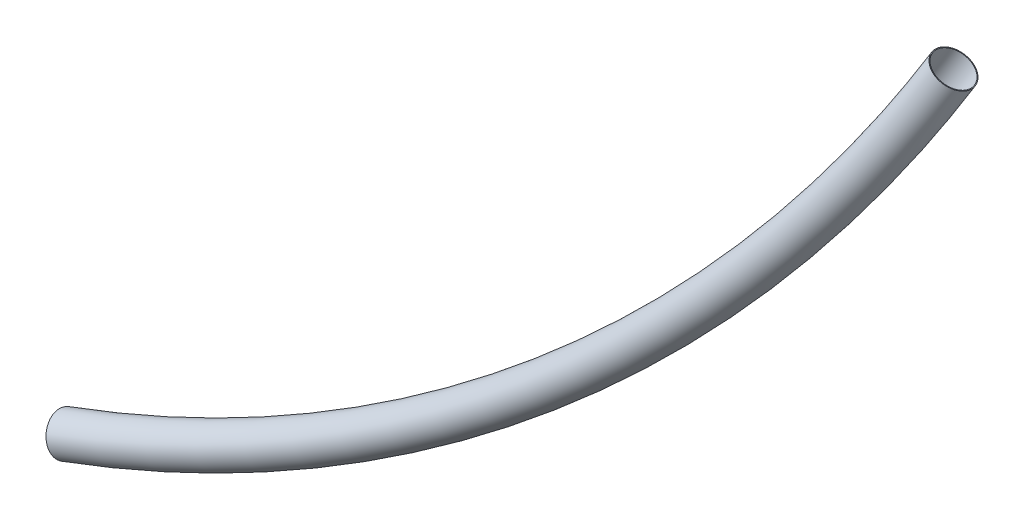
ISO-10303-21;
HEADER;
FILE_DESCRIPTION(('STEP AP214'),'2;1');
FILE_NAME('part.step','',(''),(''),'','','');
FILE_SCHEMA(('AUTOMOTIVE_DESIGN { 1 0 10303 214 1 1 1 1 }'));
ENDSEC;
DATA;
#1=APPLICATION_CONTEXT('core data for automotive mechanical design processes');
#2=APPLICATION_PROTOCOL_DEFINITION('international standard','automotive_design',2000,#1);
#3=PRODUCT_CONTEXT('',#1,'mechanical');
#4=PRODUCT('Part','Part','',(#3));
#5=PRODUCT_RELATED_PRODUCT_CATEGORY('part','',(#4));
#6=PRODUCT_DEFINITION_FORMATION('','',#4);
#7=PRODUCT_DEFINITION_CONTEXT('part definition',#1,'design');
#8=PRODUCT_DEFINITION('design','',#6,#7);
#9=PRODUCT_DEFINITION_SHAPE('','',#8);
#10=(LENGTH_UNIT() NAMED_UNIT(*) SI_UNIT(.MILLI.,.METRE.));
#11=(NAMED_UNIT(*) PLANE_ANGLE_UNIT() SI_UNIT($,.RADIAN.));
#12=(NAMED_UNIT(*) SI_UNIT($,.STERADIAN.) SOLID_ANGLE_UNIT());
#13=UNCERTAINTY_MEASURE_WITH_UNIT(LENGTH_MEASURE(1.E-05),#10,'distance_accuracy_value','');
#14=(GEOMETRIC_REPRESENTATION_CONTEXT(3) GLOBAL_UNCERTAINTY_ASSIGNED_CONTEXT((#13)) GLOBAL_UNIT_ASSIGNED_CONTEXT((#10,
#11,#12)) REPRESENTATION_CONTEXT('',''));
#15=CARTESIAN_POINT('',(0.,0.,0.));
#16=DIRECTION('',(0.,0.,1.));
#17=DIRECTION('',(1.,0.,0.));
#18=AXIS2_PLACEMENT_3D('',#15,#16,#17);
#19=CARTESIAN_POINT('',(8516.99642217387,-1259.02168144513,3224.99147900885));
#20=DIRECTION('',(-0.46359197170207,-0.867083552561219,0.182341977205477));
#21=DIRECTION('',(0.881867916549809,-0.471496529955523,0.));
#22=AXIS2_PLACEMENT_3D('',#19,#20,#21);
#23=PLANE('',#22);
#24=CARTESIAN_POINT('',(8516.99642217388,-1259.02168144513,3224.99147900885));
#25=DIRECTION('',(-0.46359197170207,-0.867083552561219,0.182341977205477));
#26=DIRECTION('',(0.881867916549809,-0.471496529955523,0.));
#27=AXIS2_PLACEMENT_3D('',#24,#25,#26);
#28=CIRCLE('',#27,80.7339);
#29=CARTESIAN_POINT('',(8588.19305836182,-1297.0874351449,3224.99147900885));
#30=VERTEX_POINT('',#29);
#31=EDGE_CURVE('E53',#30,#30,#28,.T.);
#32=ORIENTED_EDGE('',*,*,#31,.T.);
#33=EDGE_LOOP('',(#32));
#34=FACE_BOUND('',#33,.T.);
#35=CARTESIAN_POINT('',(8516.99642217387,-1259.02168144513,3224.99147900885));
#36=DIRECTION('',(-0.46359197170207,-0.867083552561219,0.182341977205477));
#37=DIRECTION('',(0.881867916549809,-0.471496529955523,0.));
#38=AXIS2_PLACEMENT_3D('',#35,#36,#37);
#39=CIRCLE('',#38,84.1375000000002);
#40=CARTESIAN_POINT('',(8591.19458400258,-1298.69222073426,3224.99147900885));
#41=VERTEX_POINT('',#40);
#42=EDGE_CURVE('E40',#41,#41,#39,.T.);
#43=ORIENTED_EDGE('',*,*,#42,.F.);
#44=EDGE_LOOP('',(#43));
#45=FACE_BOUND('',#44,.T.);
#46=ADVANCED_FACE('F37',(#34,#45),#23,.F.);
#47=CARTESIAN_POINT('',(3473.83184735843,1326.5913653168,2698.35430969954));
#48=DIRECTION('',(0.00260505369622823,0.204457537577132,0.978871967635776));
#49=DIRECTION('',(0.,-0.978875289114428,0.204458231336244));
#50=AXIS2_PLACEMENT_3D('',#47,#48,#49);
#51=TOROIDAL_SURFACE('',#50,5691.77041564021,80.7339);
#52=ORIENTED_EDGE('',*,*,#31,.F.);
#53=EDGE_LOOP('',(#52));
#54=FACE_BOUND('',#53,.T.);
#55=CARTESIAN_POINT('',(5271.00743587228,-4012.66439385455,3734.93598349893));
#56=CARTESIAN_POINT('',(5270.66498495116,-4011.83070399339,3734.24675022501));
#57=CARTESIAN_POINT('',(5270.31890145055,-4010.98288660137,3733.57646934526));
#58=CARTESIAN_POINT('',(5269.62003322443,-4009.26037992345,3732.27489627241));
#59=CARTESIAN_POINT('',(5269.26724803139,-4008.38568876008,3731.64360681268));
#60=CARTESIAN_POINT('',(5268.55556891435,-4006.61090060294,3730.42109151935));
#61=CARTESIAN_POINT('',(5268.19667388596,-4005.71079899629,3729.82987302714));
#62=CARTESIAN_POINT('',(5267.47344042779,-4003.88685413334,3728.68861781693));
#63=CARTESIAN_POINT('',(5267.10910149709,-4002.96300868658,3728.13858491693));
#64=CARTESIAN_POINT('',(5266.37528710098,-4001.09234718595,3727.08019930887));
#65=CARTESIAN_POINT('',(5266.00580678088,-4000.14550868977,3726.57188963299));
#66=CARTESIAN_POINT('',(5265.26269660957,-3998.23136530748,3725.59843309159));
#67=CARTESIAN_POINT('',(5264.88906637272,-3997.26405851162,3725.13329027568));
#68=CARTESIAN_POINT('',(5264.13841603661,-3995.3109440878,3724.2471190517));
#69=CARTESIAN_POINT('',(5263.76139649031,-3994.32513945025,3723.82608358435));
#70=CARTESIAN_POINT('',(5263.00454418637,-3992.33654084153,3723.02875258526));
#71=CARTESIAN_POINT('',(5262.62471116882,-3991.33374528948,3722.65246124307));
#72=CARTESIAN_POINT('',(5261.86315525298,-3989.31360322114,3721.94552979558));
#73=CARTESIAN_POINT('',(5261.48143352534,-3988.29626512175,3721.61486437667));
#74=CARTESIAN_POINT('',(5260.71653343945,-3986.24820569901,3720.99949510434));
#75=CARTESIAN_POINT('',(5260.3333549483,-3985.21748313289,3720.71479555235));
#76=CARTESIAN_POINT('',(5259.56628749241,-3983.14466014143,3720.19192107201));
#77=CARTESIAN_POINT('',(5259.18239858517,-3982.10256060643,3719.95374253021));
#78=CARTESIAN_POINT('',(5258.41452956978,-3980.00866665879,3719.52428478383));
#79=CARTESIAN_POINT('',(5258.03054945646,-3978.95687134874,3719.33300996664));
#80=CARTESIAN_POINT('',(5257.26334187437,-3976.8458958375,3718.99778731906));
#81=CARTESIAN_POINT('',(5256.88011418974,-3975.78671834115,3718.85382299828));
#82=CARTESIAN_POINT('',(5256.11495506441,-3973.66249193245,3718.61337059656));
#83=CARTESIAN_POINT('',(5255.7330237482,-3972.59744248062,3718.51688695383));
#84=CARTESIAN_POINT('',(5254.59027075199,-3969.39653132042,3718.29899505069));
#85=CARTESIAN_POINT('',(5253.83228018418,-3967.25432941673,3718.24905419793));
#86=CARTESIAN_POINT('',(5252.32954081469,-3962.96906689418,3718.34031815006));
#87=CARTESIAN_POINT('',(5251.5847954419,-3960.82600619569,3718.48157174172));
#88=CARTESIAN_POINT('',(5250.11390543987,-3956.55443569039,3718.95426409172));
#89=CARTESIAN_POINT('',(5249.38776083156,-3954.42592589995,3719.2857030641));
#90=CARTESIAN_POINT('',(5247.95924321266,-3950.19860672172,3720.13644350404));
#91=CARTESIAN_POINT('',(5247.25687114232,-3948.09979851061,3720.65575239283));
#92=CARTESIAN_POINT('',(5245.88091413572,-3943.9468661602,3721.8785423178));
#93=CARTESIAN_POINT('',(5245.20732919257,-3941.89274201022,3722.58202330991));
#94=CARTESIAN_POINT('',(5243.89375173318,-3937.84382918859,3724.16815142649));
#95=CARTESIAN_POINT('',(5243.25375861596,-3935.84903945568,3725.05079534423));
#96=CARTESIAN_POINT('',(5242.01190443666,-3931.93294438367,3726.98899157151));
#97=CARTESIAN_POINT('',(5241.41004337681,-3930.01163904889,3728.04454389119));
#98=CARTESIAN_POINT('',(5240.24873848175,-3926.25618864204,3730.32105925529));
#99=CARTESIAN_POINT('',(5239.68929453721,-3924.4220433453,3731.54202187329));
#100=CARTESIAN_POINT('',(5238.61680518653,-3920.85396193948,3734.14068802849));
#101=CARTESIAN_POINT('',(5238.10375977165,-3919.12002581149,3735.51839153611));
#102=CARTESIAN_POINT('',(5237.12782587628,-3915.76506613521,3738.42044108615));
#103=CARTESIAN_POINT('',(5236.66492670843,-3914.14401855408,3739.94475575095));
#104=CARTESIAN_POINT('',(5235.79245665129,-3911.02596971855,3743.12944592523));
#105=CARTESIAN_POINT('',(5235.38288575634,-3909.52896845101,3744.78982142028));
#106=CARTESIAN_POINT('',(5234.61999199201,-3906.66967777335,3748.23482801504));
#107=CARTESIAN_POINT('',(5234.2666689481,-3905.30738794526,3750.01945872918));
#108=CARTESIAN_POINT('',(5233.61878838017,-3902.72722010602,3753.70029281165));
#109=CARTESIAN_POINT('',(5233.3242308422,-3901.50934206059,3755.59649615348));
#110=CARTESIAN_POINT('',(5232.79607182494,-3899.22706339081,3759.48633123813));
#111=CARTESIAN_POINT('',(5232.56244974355,-3898.16261094829,3761.47992978053));
#112=CARTESIAN_POINT('',(5232.15769726214,-3896.194276029,3765.55097504697));
#113=CARTESIAN_POINT('',(5231.98656684905,-3895.29039351865,3767.62842175347));
#114=CARTESIAN_POINT('',(5231.70801927978,-3893.64963944021,3771.85238955101));
#115=CARTESIAN_POINT('',(5231.60060209832,-3892.91276780588,3773.99891061466));
#116=CARTESIAN_POINT('',(5231.45024863702,-3891.61128684538,3778.34575984177));
#117=CARTESIAN_POINT('',(5231.40731234577,-3891.04667748876,3780.54608799571));
#118=CARTESIAN_POINT('',(5231.38623208875,-3890.09389385722,3784.98420651887));
#119=CARTESIAN_POINT('',(5231.40806796745,-3889.70566474036,3787.22198501896));
#120=CARTESIAN_POINT('',(5231.51633490982,-3889.10814910885,3791.71975891751));
#121=CARTESIAN_POINT('',(5231.60276595914,-3888.89886255442,3793.97975431104));
#122=CARTESIAN_POINT('',(5231.83960920545,-3888.66072268667,3798.50588732864));
#123=CARTESIAN_POINT('',(5231.99002131514,-3888.63186912712,3800.77202494433));
#124=CARTESIAN_POINT('',(5232.35375680773,-3888.75479920681,3805.29432981698));
#125=CARTESIAN_POINT('',(5232.56708018828,-3888.90658283928,3807.5504970743));
#126=CARTESIAN_POINT('',(5233.05508544696,-3889.38967028026,3812.03649924927));
#127=CARTESIAN_POINT('',(5233.32975863669,-3889.72094867803,3814.26633784857));
#128=CARTESIAN_POINT('',(5233.93852598823,-3890.56064793685,3818.68415685735));
#129=CARTESIAN_POINT('',(5234.27262014221,-3891.06906877456,3820.87213727236));
#130=CARTESIAN_POINT('',(5234.99785184207,-3892.25943063008,3825.19068957133));
#131=CARTESIAN_POINT('',(5235.38898939394,-3892.94137166614,3827.32126144925));
#132=CARTESIAN_POINT('',(5236.22552449942,-3894.47391672531,3831.50985711328));
#133=CARTESIAN_POINT('',(5236.67092205949,-3895.3245207685,3833.56788089076));
#134=CARTESIAN_POINT('',(5237.61285127195,-3897.18842053379,3837.59694439208));
#135=CARTESIAN_POINT('',(5238.10938759982,-3898.20173113645,3839.56797613891));
#136=CARTESIAN_POINT('',(5239.15002779161,-3900.38377430137,3843.40885437407));
#137=CARTESIAN_POINT('',(5239.69413165635,-3901.55250686629,3845.27870086066));
#138=CARTESIAN_POINT('',(5240.8260372482,-3904.03707741523,3848.90393256688));
#139=CARTESIAN_POINT('',(5241.41383901298,-3905.35291552604,3850.65931768785));
#140=CARTESIAN_POINT('',(5242.62896026645,-3908.12233534375,3854.04316451136));
#141=CARTESIAN_POINT('',(5243.25627976383,-3909.57591708095,3855.67162618597));
#142=CARTESIAN_POINT('',(5244.54615901269,-3912.61091510639,3858.79051021053));
#143=CARTESIAN_POINT('',(5245.2087286496,-3914.19236731954,3860.28089351358));
#144=CARTESIAN_POINT('',(5246.56423486567,-3917.47150143588,3863.11252463582));
#145=CARTESIAN_POINT('',(5247.25717144961,-3919.16918335739,3864.45377243153));
#146=CARTESIAN_POINT('',(5248.66848702073,-3922.66870837319,3866.97761793528));
#147=CARTESIAN_POINT('',(5249.38686604518,-3924.47055162002,3868.16021541099));
#148=CARTESIAN_POINT('',(5250.84396065092,-3928.16558976613,3870.35836993244));
#149=CARTESIAN_POINT('',(5251.58267623673,-3930.05878468566,3871.37392694119));
#150=CARTESIAN_POINT('',(5253.07545284821,-3933.92373892293,3873.23111866393));
#151=CARTESIAN_POINT('',(5253.82951906635,-3935.89552504828,3874.07269341609));
#152=CARTESIAN_POINT('',(5255.34739079166,-3939.9030331801,3875.57551057368));
#153=CARTESIAN_POINT('',(5256.11119630103,-3941.93875520098,3876.23675293846));
#154=CARTESIAN_POINT('',(5257.64311959117,-3946.05966910383,3877.37421567115));
#155=CARTESIAN_POINT('',(5258.41123737696,-3948.14486104339,3877.85043582362));
#156=CARTESIAN_POINT('',(5259.94632655044,-3952.34989511006,3878.61447554968));
#157=CARTESIAN_POINT('',(5260.71329793798,-3954.46973724149,3878.9022950997));
#158=CARTESIAN_POINT('',(5262.24083844085,-3958.72954901101,3879.28754089574));
#159=CARTESIAN_POINT('',(5263.00140588736,-3960.86952360556,3879.38491895497));
#160=CARTESIAN_POINT('',(5264.51053547435,-3965.15385928879,3879.38844514134));
#161=CARTESIAN_POINT('',(5265.25909761252,-3967.2982203783,3879.29459323161));
#162=CARTESIAN_POINT('',(5266.73889598508,-3971.57608789151,3878.916324382));
#163=CARTESIAN_POINT('',(5267.47013220189,-3973.70959430418,3878.63190724862));
#164=CARTESIAN_POINT('',(5268.91007924986,-3977.95058317828,3877.87452489271));
#165=CARTESIAN_POINT('',(5269.61879008153,-3980.0580656403,3877.40155967439));
#166=CARTESIAN_POINT('',(5271.00868457553,-3984.23213556753,3876.27040581107));
#167=CARTESIAN_POINT('',(5271.68986675207,-3986.29872082234,3875.61220718377));
#168=CARTESIAN_POINT('',(5273.01981838459,-3990.37618236663,3874.11526783418));
#169=CARTESIAN_POINT('',(5273.66858783812,-3992.38705865186,3873.27652709818));
#170=CARTESIAN_POINT('',(5274.92909731073,-3996.33879538687,3871.42445846307));
#171=CARTESIAN_POINT('',(5275.54083738088,-3998.27965593321,3870.41113080475));
#172=CARTESIAN_POINT('',(5276.72293531901,-4002.07755443191,3868.21708255663));
#173=CARTESIAN_POINT('',(5277.29329319361,-4003.93459239766,3867.03636199357));
#174=CARTESIAN_POINT('',(5278.38847566207,-4007.55132990721,3864.51612254281));
#175=CARTESIAN_POINT('',(5278.91330776626,-4009.3110454887,3863.17662993407));
#176=CARTESIAN_POINT('',(5279.91380769297,-4012.7209455326,3860.3482043634));
#177=CARTESIAN_POINT('',(5280.3894755189,-4014.37113000259,3858.8592714118));
#178=CARTESIAN_POINT('',(5281.2882592331,-4017.55022064364,3855.74254303681));
#179=CARTESIAN_POINT('',(5281.71137508416,-4019.07912672884,3854.1147475151));
#180=CARTESIAN_POINT('',(5282.50203944011,-4022.00477063223,3850.7318647149));
#181=CARTESIAN_POINT('',(5282.86958795741,-4023.40150847993,3848.97677746481));
#182=CARTESIAN_POINT('',(5283.5463923884,-4026.05245382609,3845.35235299907));
#183=CARTESIAN_POINT('',(5283.8556663617,-4027.30670543383,3843.48305141767));
#184=CARTESIAN_POINT('',(5284.41385854659,-4029.66424579418,3839.64299354602));
#185=CARTESIAN_POINT('',(5284.66277676922,-4030.76753457438,3837.67223727432));
#186=CARTESIAN_POINT('',(5285.09848240345,-4032.81529025582,3833.64328090579));
#187=CARTESIAN_POINT('',(5285.28526977565,-4033.75975705637,3831.58508075354));
#188=CARTESIAN_POINT('',(5285.59538055369,-4035.48313788809,3827.39587668257));
#189=CARTESIAN_POINT('',(5285.71870397292,-4036.26205195422,3825.26487277922));
#190=CARTESIAN_POINT('',(5285.9009783423,-4037.64856761913,3820.94586716058));
#191=CARTESIAN_POINT('',(5285.95994859096,-4038.25622053591,3818.75788273448));
#192=CARTESIAN_POINT('',(5286.01316137584,-4039.29619694726,3814.33986807669));
#193=CARTESIAN_POINT('',(5286.00740391347,-4039.72852044564,3812.10983784591));
#194=CARTESIAN_POINT('',(5285.93119853948,-4040.41474035987,3807.62365375999));
#195=CARTESIAN_POINT('',(5285.86075321892,-4040.66864392154,3805.36750095474));
#196=CARTESIAN_POINT('',(5285.65568821424,-4040.99625725645,3800.8451361574));
#197=CARTESIAN_POINT('',(5285.52106860039,-4041.06996722698,3798.57892417633));
#198=CARTESIAN_POINT('',(5285.18861628886,-4041.03662214038,3794.05284654625));
#199=CARTESIAN_POINT('',(5284.99080254282,-4040.92962123644,3791.79297919922));
#200=CARTESIAN_POINT('',(5284.64781582016,-4040.63431545015,3788.42025494713));
#201=CARTESIAN_POINT('',(5284.52575609813,-4040.51338710111,3787.29870791163));
#202=CARTESIAN_POINT('',(5284.26642037487,-4040.2268107591,3785.06314042762));
#203=CARTESIAN_POINT('',(5284.12914579687,-4040.06116694689,3783.94911928544));
#204=CARTESIAN_POINT('',(5283.83957172104,-4039.68538380026,3781.73019024118));
#205=CARTESIAN_POINT('',(5283.68726700645,-4039.47522898749,3780.62528564854));
#206=CARTESIAN_POINT('',(5283.36795693953,-4039.01085479903,3778.42702421568));
#207=CARTESIAN_POINT('',(5283.200952963,-4038.75663954513,3777.33366630544));
#208=CARTESIAN_POINT('',(5282.8525164216,-4038.20456249989,3775.16025988828));
#209=CARTESIAN_POINT('',(5282.67108273604,-4037.90669731696,3774.08021242265));
#210=CARTESIAN_POINT('',(5282.29413862114,-4037.26789581825,3771.93553245297));
#211=CARTESIAN_POINT('',(5282.09862950951,-4036.92696353206,3770.87089851711));
#212=CARTESIAN_POINT('',(5281.69375413559,-4036.20241033551,3768.75824348505));
#213=CARTESIAN_POINT('',(5281.48438016909,-4035.81876560936,3767.71023203309));
#214=CARTESIAN_POINT('',(5281.05226641963,-4035.0096649215,3765.63339515698));
#215=CARTESIAN_POINT('',(5280.8295278883,-4034.58421287281,3764.60456794796));
#216=CARTESIAN_POINT('',(5280.37102739459,-4033.69215455634,3762.56766598626));
#217=CARTESIAN_POINT('',(5280.13526335408,-4033.22554171447,3761.55959458047));
#218=CARTESIAN_POINT('',(5279.65118716021,-4032.25209764944,3759.56626087401));
#219=CARTESIAN_POINT('',(5279.4028761839,-4031.74527019633,3758.58099644639));
#220=CARTESIAN_POINT('',(5278.8943860408,-4030.69279603301,3756.63591819851));
#221=CARTESIAN_POINT('',(5278.63421916491,-4030.14718921067,3755.67607958201));
#222=CARTESIAN_POINT('',(5278.10227130411,-4029.01772572087,3753.78260859438));
#223=CARTESIAN_POINT('',(5277.83049139543,-4028.43387259523,3752.84897380804));
#224=CARTESIAN_POINT('',(5277.27582668175,-4027.22901493604,3751.00963730617));
#225=CARTESIAN_POINT('',(5276.99294390709,-4026.60801718422,3750.10393053713));
#226=CARTESIAN_POINT('',(5276.41655629837,-4025.32993780534,3748.32195826578));
#227=CARTESIAN_POINT('',(5276.12305220732,-4024.67285870067,3747.4456907123));
#228=CARTESIAN_POINT('',(5275.45171562372,-4023.1560797171,3745.51013654943));
#229=CARTESIAN_POINT('',(5275.07104948897,-4022.28659950819,3744.45947064349));
#230=CARTESIAN_POINT('',(5274.29507982835,-4020.4957471318,3742.40948365693));
#231=CARTESIAN_POINT('',(5273.89977956431,-4019.57438650451,3741.41015125162));
#232=CARTESIAN_POINT('',(5273.09554885902,-4017.68213330017,3739.46531586601));
#233=CARTESIAN_POINT('',(5272.68661841935,-4016.71124072882,3738.51981287952));
#234=CARTESIAN_POINT('',(5271.85615668475,-4014.72236495909,3736.685028782));
#235=CARTESIAN_POINT('',(5271.43462261581,-4013.70437136649,3735.79576018419));
#236=CARTESIAN_POINT('',(5271.00743587228,-4012.66439385455,3734.93598349893));
#237=B_SPLINE_CURVE_WITH_KNOTS('',3,(#55,#56,#57,#58,#59,#60,#61,#62,#63,#64,#65,#66,#67,#68,
#69,#70,#71,#72,#73,#74,#75,#76,#77,#78,#79,#80,#81,#82,#83,#84,#85,#86,#87,#88,#89,#90,#91,#92,
#93,#94,#95,#96,#97,#98,#99,#100,#101,#102,#103,#104,#105,#106,#107,#108,#109,#110,#111,#112,
#113,#114,#115,#116,#117,#118,#119,#120,#121,#122,#123,#124,#125,#126,#127,#128,#129,#130,#131,
#132,#133,#134,#135,#136,#137,#138,#139,#140,#141,#142,#143,#144,#145,#146,#147,#148,#149,#150,
#151,#152,#153,#154,#155,#156,#157,#158,#159,#160,#161,#162,#163,#164,#165,#166,#167,#168,#169,
#170,#171,#172,#173,#174,#175,#176,#177,#178,#179,#180,#181,#182,#183,#184,#185,#186,#187,#188,
#189,#190,#191,#192,#193,#194,#195,#196,#197,#198,#199,#200,#201,#202,#203,#204,#205,#206,#207,
#208,#209,#210,#211,#212,#213,#214,#215,#216,#217,#218,#219,#220,#221,#222,#223,#224,#225,#226,
#227,#228,#229,#230,#231,#232,#233,#234,#235,#236),.UNSPECIFIED.,.T.,.F.,(4,2,2,2,2,2,2,2,2,2,2,
2,2,2,2,2,2,2,2,2,2,2,2,2,2,2,2,2,2,2,2,2,2,2,2,2,2,2,2,2,2,2,2,2,2,2,2,2,2,2,2,2,2,2,2,2,2,2,2,
2,2,2,2,2,2,2,2,2,2,2,2,2,2,2,2,2,2,2,2,2,2,2,2,2,2,2,2,2,2,2,4),(0.,3.40353472593748,
6.80730777634821,10.2117027550735,13.6164129389595,17.0245916412981,20.4330897515771,
23.8410415029102,27.2493121012624,30.6556840954222,34.0623746696927,37.4688005299178,
40.8755449057775,44.2811005756542,47.6869745173889,54.4968649258857,61.3084933303509,
68.1201294012379,74.9320345743003,81.7439381173756,88.5557197489832,95.3675017801366,
102.179266251548,108.991029437139,115.801338004011,122.611645848808,129.421932562427,
136.232217658641,143.040197222572,149.848175362856,156.656150803053,163.464125039443,
170.26998102057,177.075835489341,183.881680670612,190.687525596853,197.492407284122,
204.297288074895,211.102169581124,217.907051897266,224.712556918643,231.51806205694,
238.323573060804,245.129085561678,251.936516742823,258.743948996504,265.551391219363,
272.358834949722,279.168620923908,285.978408433364,292.788203872065,299.598000162443,
306.409519290207,313.221039730918,320.032567087741,326.844094291806,333.655988641644,
340.467883508591,347.279768980197,354.091653363226,360.90241185534,367.713169877199,
374.523932721831,381.334694046048,388.143341193081,394.951987095497,401.760637314383,
408.56928609573,415.375892507983,422.182498772785,428.988832414004,435.79515860321,
442.599445519106,446.002517048631,449.405270511595,452.809209203537,456.212829633656,
459.616714664288,463.020281443651,466.425755594607,469.830911309258,473.23661187533,
476.641993539302,480.043921802551,483.445535472517,486.846529971483,490.247287013798,
494.492990005085,498.737752291519,502.982514088773,507.228217126552),.UNSPECIFIED.);
#238=CARTESIAN_POINT('',(5271.00743587228,-4012.66439385455,3734.93598349893));
#239=VERTEX_POINT('',#238);
#240=EDGE_CURVE('E48',#239,#239,#237,.T.);
#241=ORIENTED_EDGE('',*,*,#240,.F.);
#242=EDGE_LOOP('',(#241));
#243=FACE_BOUND('',#242,.T.);
#244=ADVANCED_FACE('F62',(#54,#243),#51,.F.);
#245=CARTESIAN_POINT('',(5226.28134061529,-3889.83136832527,3714.24503647697));
#246=DIRECTION('',(0.941114351142537,0.331446569951202,-0.0666854507455972));
#247=DIRECTION('',(-0.332186000076311,0.943213900106069,0.));
#248=AXIS2_PLACEMENT_3D('',#245,#246,#247);
#249=PLANE('',#248);
#250=ORIENTED_EDGE('',*,*,#240,.T.);
#251=EDGE_LOOP('',(#250));
#252=FACE_BOUND('',#251,.T.);
#253=CARTESIAN_POINT('',(5272.36474503003,-4016.71053148996,3733.98082292348));
#254=CARTESIAN_POINT('',(5272.01405932772,-4015.86548993203,3733.23179565016));
#255=CARTESIAN_POINT('',(5271.65933948037,-4015.005123336,3732.5020055494));
#256=CARTESIAN_POINT('',(5270.94240961926,-4013.2551440746,3731.08208026856));
#257=CARTESIAN_POINT('',(5270.58019908272,-4012.36552936544,3730.39194786896));
#258=CARTESIAN_POINT('',(5269.84889600435,-4010.55854444487,3729.05251224666));
#259=CARTESIAN_POINT('',(5269.47980221707,-4009.64116919145,3728.40321650764));
#260=CARTESIAN_POINT('',(5268.73541662867,-4007.78035853929,3727.14668077002));
#261=CARTESIAN_POINT('',(5268.36012425684,-4006.83692073553,3726.53944467088));
#262=CARTESIAN_POINT('',(5267.60365717341,-4004.92477110555,3725.36757597365));
#263=CARTESIAN_POINT('',(5267.22247685853,-4003.95603450992,3724.80298740931));
#264=CARTESIAN_POINT('',(5266.45525068169,-4001.99584497857,3723.71805106759));
#265=CARTESIAN_POINT('',(5266.06920436709,-4001.00438992241,3723.19770744138));
#266=CARTESIAN_POINT('',(5265.29303104794,-3999.00077794051,3722.20232494094));
#267=CARTESIAN_POINT('',(5264.90290470746,-3997.98862435873,3721.7272788178));
#268=CARTESIAN_POINT('',(5264.11916826124,-3995.94516791741,3720.82319872162));
#269=CARTESIAN_POINT('',(5263.72555783299,-3994.91386327512,3720.39416905764));
#270=CARTESIAN_POINT('',(5262.93581034189,-3992.83461325155,3719.5831614291));
#271=CARTESIAN_POINT('',(5262.53967481065,-3991.78667747201,3719.20115735614));
#272=CARTESIAN_POINT('',(5261.74532724053,-3989.67536965874,3718.48456678524));
#273=CARTESIAN_POINT('',(5261.34711501091,-3988.61199619052,3718.14998472534));
#274=CARTESIAN_POINT('',(5260.54938936811,-3986.47188160338,3717.52889855082));
#275=CARTESIAN_POINT('',(5260.14987605845,-3985.39514152964,3717.24239070222));
#276=CARTESIAN_POINT('',(5259.35019283467,-3983.23003297734,3716.71790515646));
#277=CARTESIAN_POINT('',(5258.95002286266,-3982.14166342089,3716.47993199955));
#278=CARTESIAN_POINT('',(5258.14990562902,-3979.95568593243,3716.05304621983));
#279=CARTESIAN_POINT('',(5257.7499583384,-3978.85808135628,3715.86411650822));
#280=CARTESIAN_POINT('',(5256.95085442361,-3976.65520404539,3715.53552858839));
#281=CARTESIAN_POINT('',(5256.55169787682,-3975.54993060361,3715.39587498645));
#282=CARTESIAN_POINT('',(5255.3565594219,-3972.22576498637,3715.0512921803));
#283=CARTESIAN_POINT('',(5254.56268987266,-3969.99792965463,3714.9206242984));
#284=CARTESIAN_POINT('',(5252.98653264591,-3965.53506517166,3714.85849589301));
#285=CARTESIAN_POINT('',(5252.20424812876,-3963.30003425277,3714.92708875676));
#286=CARTESIAN_POINT('',(5250.65689948184,-3958.83887547703,3715.26305044164));
#287=CARTESIAN_POINT('',(5249.89183537155,-3956.61274763026,3715.53041948765));
#288=CARTESIAN_POINT('',(5248.38437467102,-3952.18523713381,3716.26206736394));
#289=CARTESIAN_POINT('',(5247.64197897945,-3949.98385546735,3716.72635399003));
#290=CARTESIAN_POINT('',(5246.1851558769,-3945.62155187643,3717.84853930295));
#291=CARTESIAN_POINT('',(5245.47072845969,-3943.46062994296,3718.5064379466));
#292=CARTESIAN_POINT('',(5244.07492176689,-3939.19460795109,3720.01118366554));
#293=CARTESIAN_POINT('',(5243.39354266486,-3937.08950818588,3720.85803173297));
#294=CARTESIAN_POINT('',(5242.06868315724,-3932.95011306715,3722.73466323978));
#295=CARTESIAN_POINT('',(5241.42520275444,-3930.91581771881,3723.76444669259));
#296=CARTESIAN_POINT('',(5240.18072155533,-3926.93251005338,3725.99963510166));
#297=CARTESIAN_POINT('',(5239.57972065361,-3924.98349752464,3727.20503962208));
#298=CARTESIAN_POINT('',(5238.42447504055,-3921.18462044423,3729.78291156427));
#299=CARTESIAN_POINT('',(5237.87023032087,-3919.33475587483,3731.1553789562));
#300=CARTESIAN_POINT('',(5236.81254711496,-3915.7476930028,3734.05734391147));
#301=CARTESIAN_POINT('',(5236.30909875635,-3914.01047283103,3735.58681084457));
#302=CARTESIAN_POINT('',(5235.35647086307,-3910.66067185199,3738.79213165246));
#303=CARTESIAN_POINT('',(5234.90729132341,-3909.04809103325,3740.46798551378));
#304=CARTESIAN_POINT('',(5234.06640275832,-3905.95905677096,3743.95416595918));
#305=CARTESIAN_POINT('',(5233.67469355748,-3904.48260291193,3745.7644921328));
#306=CARTESIAN_POINT('',(5232.95153635335,-3901.67633478291,3749.50675255081));
#307=CARTESIAN_POINT('',(5232.62008833572,-3900.34652047805,3751.43868676629));
#308=CARTESIAN_POINT('',(5232.01991730329,-3897.84342438492,3755.40976350949));
#309=CARTESIAN_POINT('',(5231.75117344814,-3896.6700906445,3757.44887014055));
#310=CARTESIAN_POINT('',(5231.27818557458,-3894.48779297746,3761.62038577868));
#311=CARTESIAN_POINT('',(5231.07394154309,-3893.47882901756,3763.75279476687));
#312=CARTESIAN_POINT('',(5230.73141089861,-3891.63246054126,3768.09575098704));
#313=CARTESIAN_POINT('',(5230.59312425839,-3890.79505595404,3770.30629818677));
#314=CARTESIAN_POINT('',(5230.38349612121,-3889.29777404331,3774.78980848648));
#315=CARTESIAN_POINT('',(5230.31215461172,-3888.63789668656,3777.06277157477));
#316=CARTESIAN_POINT('',(5230.23693956558,-3887.50055576959,3781.65420468383));
#317=CARTESIAN_POINT('',(5230.23304435526,-3887.02303365831,3783.97265984607));
#318=CARTESIAN_POINT('',(5230.29269636442,-3886.25350509819,3788.63929942264));
#319=CARTESIAN_POINT('',(5230.35624356865,-3885.9614986074,3790.98748383024));
#320=CARTESIAN_POINT('',(5230.55032955273,-3885.56508159946,3795.69687934319));
#321=CARTESIAN_POINT('',(5230.68086823607,-3885.46067081208,3798.05809042977));
#322=CARTESIAN_POINT('',(5231.00800894375,-3885.44018749107,3802.77675001462));
#323=CARTESIAN_POINT('',(5231.20461096456,-3885.52411494739,3805.13419851309));
#324=CARTESIAN_POINT('',(5231.66244195719,-3885.87967979527,3809.82818445508));
#325=CARTESIAN_POINT('',(5231.92366039405,-3886.15128660082,3812.16472524308));
#326=CARTESIAN_POINT('',(5232.50888160568,-3886.88024177912,3816.80067482287));
#327=CARTESIAN_POINT('',(5232.83288437139,-3887.33759012507,3819.10008362001));
#328=CARTESIAN_POINT('',(5233.54136841942,-3888.43476948595,3823.6454254597));
#329=CARTESIAN_POINT('',(5233.9258497021,-3889.07460050196,3825.89135850194));
#330=CARTESIAN_POINT('',(5234.75255464952,-3890.5321873798,3830.31378821957));
#331=CARTESIAN_POINT('',(5235.19477832034,-3891.34994326036,3832.49028488767));
#332=CARTESIAN_POINT('',(5236.13385368869,-3893.15761858543,3836.75852506138));
#333=CARTESIAN_POINT('',(5236.63070914491,-3894.14754987846,3838.85026272195));
#334=CARTESIAN_POINT('',(5237.67548800593,-3896.29248905963,3842.93396677541));
#335=CARTESIAN_POINT('',(5238.2234114108,-3897.44749694806,3844.92593316814));
#336=CARTESIAN_POINT('',(5239.36642901599,-3899.9143694873,3848.79595020073));
#337=CARTESIAN_POINT('',(5239.96152325332,-3901.2262342612,3850.67400075121));
#338=CARTESIAN_POINT('',(5241.19465022833,-3903.99748608702,3854.30285199416));
#339=CARTESIAN_POINT('',(5241.83268297521,-3905.45687317056,3856.05365265935));
#340=CARTESIAN_POINT('',(5243.14732744789,-3908.51320022337,3859.41603019562));
#341=CARTESIAN_POINT('',(5243.82394947631,-3910.11017698522,3861.02756959491));
#342=CARTESIAN_POINT('',(5245.21080534329,-3913.42998684872,3864.09945956401));
#343=CARTESIAN_POINT('',(5245.92103918676,-3915.15281996878,3865.55981011168));
#344=CARTESIAN_POINT('',(5247.37007093748,-3918.71209431587,3868.31896221979));
#345=CARTESIAN_POINT('',(5248.10886888592,-3920.54853570676,3869.61776354722));
#346=CARTESIAN_POINT('',(5249.60977766466,-3924.32197036122,3872.04460203236));
#347=CARTESIAN_POINT('',(5250.37188850022,-3926.25896364753,3873.17263915145));
#348=CARTESIAN_POINT('',(5251.91427491775,-3930.2204216757,3875.25030850138));
#349=CARTESIAN_POINT('',(5252.69455667836,-3932.24491637698,3876.19987902265));
#350=CARTESIAN_POINT('',(5254.26748496403,-3936.3663610905,3877.9133962613));
#351=CARTESIAN_POINT('',(5255.06013149185,-3938.46331111892,3878.67734293724));
#352=CARTESIAN_POINT('',(5256.65215740312,-3942.71476523502,3880.01419449038));
#353=CARTESIAN_POINT('',(5257.45153679468,-3944.86926939203,3880.58709913744));
#354=CARTESIAN_POINT('',(5259.05134769181,-3949.22051950767,3881.53780229476));
#355=CARTESIAN_POINT('',(5259.85177919751,-3951.41726547211,3881.91560077816));
#356=CARTESIAN_POINT('',(5261.44822152963,-3955.83798372111,3882.47348692511));
#357=CARTESIAN_POINT('',(5262.24423111458,-3958.06196314037,3882.65352160666));
#358=CARTESIAN_POINT('',(5263.82595511039,-3962.52076162747,3882.81442158151));
#359=CARTESIAN_POINT('',(5264.61166951918,-3964.75558069747,3882.7952868349));
#360=CARTESIAN_POINT('',(5266.16721888445,-3969.22017526736,3882.5579828253));
#361=CARTESIAN_POINT('',(5266.93705382348,-3971.4499507617,3882.33981334365));
#362=CARTESIAN_POINT('',(5268.45537069457,-3975.88860530143,3881.70598655));
#363=CARTESIAN_POINT('',(5269.20385262679,-3978.09748434698,3881.2903292395));
#364=CARTESIAN_POINT('',(5270.67419765414,-3982.47880876037,3880.26443616198));
#365=CARTESIAN_POINT('',(5271.39605873015,-3984.65125135781,3879.65418566924));
#366=CARTESIAN_POINT('',(5272.80796829719,-3988.94408257461,3878.24344576905));
#367=CARTESIAN_POINT('',(5273.49801678538,-3991.06447118932,3877.44295634457));
#368=CARTESIAN_POINT('',(5274.84139125859,-3995.23810980718,3875.6574213129));
#369=CARTESIAN_POINT('',(5275.49471729096,-3997.29135989692,3874.6723759437));
#370=CARTESIAN_POINT('',(5276.75999864901,-4001.3161163719,3872.5247218058));
#371=CARTESIAN_POINT('',(5277.37195398084,-4003.28762276932,3871.36211306355));
#372=CARTESIAN_POINT('',(5278.55005182844,-4007.13458103872,3868.86777089671));
#373=CARTESIAN_POINT('',(5279.1162010172,-4009.0100468871,3867.53606217929));
#374=CARTESIAN_POINT('',(5280.19875561571,-4012.65188627424,3864.7128450829));
#375=CARTESIAN_POINT('',(5280.71516102822,-4014.41825981903,3863.22133671276));
#376=CARTESIAN_POINT('',(5281.69455073822,-4017.82934142231,3860.08911546431));
#377=CARTESIAN_POINT('',(5282.1575349947,-4019.4740493874,3858.44840247145));
#378=CARTESIAN_POINT('',(5283.02678323596,-4022.63008590589,3855.02943354212));
#379=CARTESIAN_POINT('',(5283.43304723327,-4024.14141448875,3853.25117763602));
#380=CARTESIAN_POINT('',(5284.18584563667,-4027.01949219473,3849.57032071742));
#381=CARTESIAN_POINT('',(5284.53239801617,-4028.3862847757,3847.66775736055));
#382=CARTESIAN_POINT('',(5285.16345291892,-4030.96607819522,3843.75132803722));
#383=CARTESIAN_POINT('',(5285.44795545301,-4032.17907906062,3841.73746209019));
#384=CARTESIAN_POINT('',(5285.95288218335,-4034.44264891158,3837.61274421434));
#385=CARTESIAN_POINT('',(5286.17330633874,-4035.49321779357,3835.50189222369));
#386=CARTESIAN_POINT('',(5286.54850342582,-4037.42443685547,3831.19821627142));
#387=CARTESIAN_POINT('',(5286.70327637181,-4038.30508707244,3829.00539232766));
#388=CARTESIAN_POINT('',(5286.94602865171,-4039.88995033124,3824.55404899469));
#389=CARTESIAN_POINT('',(5287.03402834832,-4040.59421711779,3822.29554985165));
#390=CARTESIAN_POINT('',(5287.14268378101,-4041.82164676983,3817.728284315));
#391=CARTESIAN_POINT('',(5287.16333951861,-4042.34480963937,3815.41951792251));
#392=CARTESIAN_POINT('',(5287.1371551699,-4043.20628368286,3810.76820223532));
#393=CARTESIAN_POINT('',(5287.09031779043,-4043.5446022693,3808.42565429918));
#394=CARTESIAN_POINT('',(5286.9294955474,-4044.03402058065,3803.72345707375));
#395=CARTESIAN_POINT('',(5286.81551075825,-4044.18512051306,3801.36380780342));
#396=CARTESIAN_POINT('',(5286.52120711943,-4044.29896643043,3796.64452925941));
#397=CARTESIAN_POINT('',(5286.34090927959,-4044.26177202471,3794.28490021585));
#398=CARTESIAN_POINT('',(5286.0217629453,-4044.06511615222,3790.75830965854));
#399=CARTESIAN_POINT('',(5285.90724530308,-4043.97606506816,3789.58476251564));
#400=CARTESIAN_POINT('',(5285.66217050549,-4043.75117176145,3787.24387267751));
#401=CARTESIAN_POINT('',(5285.53161485031,-4043.61533391307,3786.07652941262));
#402=CARTESIAN_POINT('',(5285.25464559287,-4043.29704816193,3783.74970968226));
#403=CARTESIAN_POINT('',(5285.10822648401,-4043.11458404398,3782.59023609793));
#404=CARTESIAN_POINT('',(5284.7998410532,-4042.703414281,3780.28170934606));
#405=CARTESIAN_POINT('',(5284.63787618627,-4042.47471296135,3779.13265521431));
#406=CARTESIAN_POINT('',(5284.29866328921,-4041.97144596136,3776.84681920519));
#407=CARTESIAN_POINT('',(5284.12141407203,-4041.69687671714,3775.71003828875));
#408=CARTESIAN_POINT('',(5283.75197605379,-4041.10240356014,3773.45096482784));
#409=CARTESIAN_POINT('',(5283.55978865121,-4040.78250388877,3772.32867093857));
#410=CARTESIAN_POINT('',(5283.16069442991,-4040.09773606142,3770.09985865847));
#411=CARTESIAN_POINT('',(5282.95377973857,-4039.73284377666,3768.99334909046));
#412=CARTESIAN_POINT('',(5282.52571141412,-4038.95891385771,3766.79879503461));
#413=CARTESIAN_POINT('',(5282.30455911435,-4038.54988035494,3765.71074882968));
#414=CARTESIAN_POINT('',(5281.84835568309,-4037.68830032875,3763.55477852164));
#415=CARTESIAN_POINT('',(5281.61330233337,-4037.23574685352,3762.48685766602));
#416=CARTESIAN_POINT('',(5281.12977038526,-4036.28803332616,3760.37331631495));
#417=CARTESIAN_POINT('',(5280.88129304607,-4035.7928772677,3759.32769374066));
#418=CARTESIAN_POINT('',(5280.37159419799,-4034.76132807961,3757.26155399026));
#419=CARTESIAN_POINT('',(5280.11038587025,-4034.22497728329,3756.24101242705));
#420=CARTESIAN_POINT('',(5279.57548228912,-4033.11160637066,3754.22584322453));
#421=CARTESIAN_POINT('',(5279.30178819276,-4032.53459002001,3753.23121319744));
#422=CARTESIAN_POINT('',(5278.74242615142,-4031.3409745497,3751.26970750695));
#423=CARTESIAN_POINT('',(5278.45676039525,-4030.72438265484,3750.30282682409));
#424=CARTESIAN_POINT('',(5277.87394307915,-4029.45267765657,3748.39843119972));
#425=CARTESIAN_POINT('',(5277.57679232263,-4028.79756724598,3747.4609142124));
#426=CARTESIAN_POINT('',(5276.89630576239,-4027.28250179063,3745.38771207259));
#427=CARTESIAN_POINT('',(5276.50989734836,-4026.41208688503,3744.26065259996));
#428=CARTESIAN_POINT('',(5275.72112513401,-4024.61556853096,3742.05814811433));
#429=CARTESIAN_POINT('',(5275.31876488804,-4023.68947746464,3740.98269171999));
#430=CARTESIAN_POINT('',(5274.49911491836,-4021.78398130185,3738.88606973404));
#431=CARTESIAN_POINT('',(5274.0818251965,-4020.80457621203,3737.86490413566));
#432=CARTESIAN_POINT('',(5273.23336645518,-4018.79491416337,3735.87944698522));
#433=CARTESIAN_POINT('',(5272.80219437853,-4017.76464597634,3734.91516809513));
#434=CARTESIAN_POINT('',(5272.36474503003,-4016.71053148996,3733.98082292348));
#435=B_SPLINE_CURVE_WITH_KNOTS('',3,(#253,#254,#255,#256,#257,#258,#259,#260,#261,#262,#263,
#264,#265,#266,#267,#268,#269,#270,#271,#272,#273,#274,#275,#276,#277,#278,#279,#280,#281,#282,
#283,#284,#285,#286,#287,#288,#289,#290,#291,#292,#293,#294,#295,#296,#297,#298,#299,#300,#301,
#302,#303,#304,#305,#306,#307,#308,#309,#310,#311,#312,#313,#314,#315,#316,#317,#318,#319,#320,
#321,#322,#323,#324,#325,#326,#327,#328,#329,#330,#331,#332,#333,#334,#335,#336,#337,#338,#339,
#340,#341,#342,#343,#344,#345,#346,#347,#348,#349,#350,#351,#352,#353,#354,#355,#356,#357,#358,
#359,#360,#361,#362,#363,#364,#365,#366,#367,#368,#369,#370,#371,#372,#373,#374,#375,#376,#377,
#378,#379,#380,#381,#382,#383,#384,#385,#386,#387,#388,#389,#390,#391,#392,#393,#394,#395,#396,
#397,#398,#399,#400,#401,#402,#403,#404,#405,#406,#407,#408,#409,#410,#411,#412,#413,#414,#415,
#416,#417,#418,#419,#420,#421,#422,#423,#424,#425,#426,#427,#428,#429,#430,#431,#432,#433,#434),
.UNSPECIFIED.,.T.,.F.,(4,2,2,2,2,2,2,2,2,2,2,2,2,2,2,2,2,2,2,2,2,2,2,2,2,2,2,2,2,2,2,2,2,2,2,2,
2,2,2,2,2,2,2,2,2,2,2,2,2,2,2,2,2,2,2,2,2,2,2,2,2,2,2,2,2,2,2,2,2,2,2,2,2,2,2,2,2,2,2,2,2,2,2,2,
2,2,2,2,2,2,4),(0.,3.54693352896419,7.09411543745828,10.6419455157309,14.1901040853832,
17.7418774402067,21.2939836647783,24.8455204918401,28.3973896016796,31.9472777513119,
35.4974979024859,39.0474421752747,42.5977183803913,46.1467558544805,49.6961250010146,
56.7929276997131,63.8916319952181,70.9903443215684,78.0893377064179,85.1883295082824,
92.2873585865695,99.3863881853795,106.485400165936,113.584410877916,120.682039213026,
127.779666894784,134.877272912492,141.974877242776,149.07011924402,156.165359808413,
163.260597443298,170.355833748972,177.448789979194,184.541744605284,191.634689013965,
198.727633044555,205.819421413676,212.911208758742,220.00299614578,227.09478427905,
234.187060638655,241.27933701058,248.37161894765,255.463902404875,262.558088317693,
269.652275268834,276.746472452541,283.840671240566,290.937318541108,298.033967426479,
305.130624861198,312.227283272858,319.325842454434,326.424403057657,333.522971459277,
340.621539807297,347.72064546316,354.819751754547,361.918848891886,369.017944971868,
376.116004994954,383.214064625794,390.312129706067,397.410193219035,404.506116442459,
411.602038427068,418.697964936024,425.793889897746,432.887650065788,439.98141007546,
447.074885595626,454.168353254109,461.259575437368,464.806153744252,468.352400557232,
471.899882329256,475.447032397007,478.994458202614,482.541552306145,486.090556997511,
489.639229806083,493.188470418119,496.737378677375,500.282687520824,503.827668495821,
507.372004138741,510.916092290741,515.3405776832,519.76408270341,524.187587171626,
528.612072547548),.UNSPECIFIED.);
#436=CARTESIAN_POINT('',(5272.36474503003,-4016.71053148996,3733.98082292348));
#437=VERTEX_POINT('',#436);
#438=EDGE_CURVE('E12',#437,#437,#435,.T.);
#439=ORIENTED_EDGE('',*,*,#438,.F.);
#440=EDGE_LOOP('',(#439));
#441=FACE_BOUND('',#440,.T.);
#442=ADVANCED_FACE('F59',(#252,#441),#249,.F.);
#443=CARTESIAN_POINT('',(3473.83184735843,1326.5913653168,2698.35430969954));
#444=DIRECTION('',(0.00260505369622823,0.204457537577132,0.978871967635776));
#445=DIRECTION('',(0.,-0.978875289114428,0.204458231336244));
#446=AXIS2_PLACEMENT_3D('',#443,#444,#445);
#447=TOROIDAL_SURFACE('',#446,5691.77041564021,84.1375000000002);
#448=ORIENTED_EDGE('',*,*,#42,.T.);
#449=EDGE_LOOP('',(#448));
#450=FACE_BOUND('',#449,.T.);
#451=ORIENTED_EDGE('',*,*,#438,.T.);
#452=EDGE_LOOP('',(#451));
#453=FACE_BOUND('',#452,.T.);
#454=ADVANCED_FACE('F57',(#450,#453),#447,.T.);
#455=CLOSED_SHELL('',(#46,#244,#442,#454));
#456=MANIFOLD_SOLID_BREP('B2',#455);
#457=ADVANCED_BREP_SHAPE_REPRESENTATION('',(#18,#456),#14);
#458=SHAPE_DEFINITION_REPRESENTATION(#9,#457);
ENDSEC;
END-ISO-10303-21;
